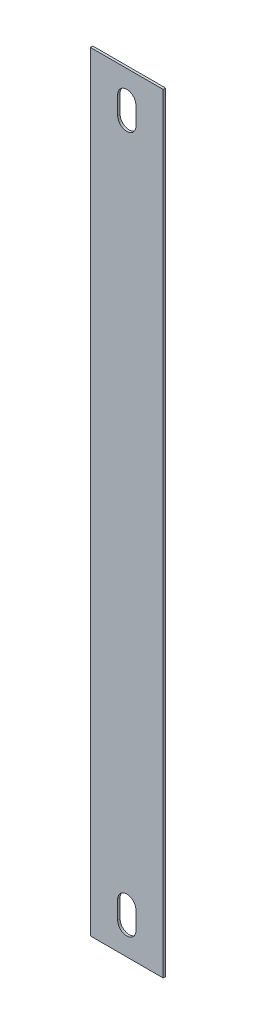
ISO-10303-21;
HEADER;
FILE_DESCRIPTION(('STEP AP214'),'2;1');
FILE_NAME('part.step','',(''),(''),'','','');
FILE_SCHEMA(('AUTOMOTIVE_DESIGN { 1 0 10303 214 1 1 1 1 }'));
ENDSEC;
DATA;
#1=APPLICATION_CONTEXT('core data for automotive mechanical design processes');
#2=APPLICATION_PROTOCOL_DEFINITION('international standard','automotive_design',2000,#1);
#3=PRODUCT_CONTEXT('',#1,'mechanical');
#4=PRODUCT('Part','Part','',(#3));
#5=PRODUCT_RELATED_PRODUCT_CATEGORY('part','',(#4));
#6=PRODUCT_DEFINITION_FORMATION('','',#4);
#7=PRODUCT_DEFINITION_CONTEXT('part definition',#1,'design');
#8=PRODUCT_DEFINITION('design','',#6,#7);
#9=PRODUCT_DEFINITION_SHAPE('','',#8);
#10=(LENGTH_UNIT() NAMED_UNIT(*) SI_UNIT(.MILLI.,.METRE.));
#11=(NAMED_UNIT(*) PLANE_ANGLE_UNIT() SI_UNIT($,.RADIAN.));
#12=(NAMED_UNIT(*) SI_UNIT($,.STERADIAN.) SOLID_ANGLE_UNIT());
#13=UNCERTAINTY_MEASURE_WITH_UNIT(LENGTH_MEASURE(1.E-05),#10,'distance_accuracy_value','');
#14=(GEOMETRIC_REPRESENTATION_CONTEXT(3) GLOBAL_UNCERTAINTY_ASSIGNED_CONTEXT((#13)) GLOBAL_UNIT_ASSIGNED_CONTEXT((#10,
#11,#12)) REPRESENTATION_CONTEXT('',''));
#15=CARTESIAN_POINT('',(0.,0.,0.));
#16=DIRECTION('',(0.,0.,1.));
#17=DIRECTION('',(1.,0.,0.));
#18=AXIS2_PLACEMENT_3D('',#15,#16,#17);
#19=CARTESIAN_POINT('',(-30.,-317.32,2.));
#20=DIRECTION('',(1.,0.,0.));
#21=DIRECTION('',(0.,0.,-1.));
#22=AXIS2_PLACEMENT_3D('',#19,#20,#21);
#23=PLANE('',#22);
#24=DIRECTION('',(0.,-1.,0.));
#25=VECTOR('',#24,1.);
#26=CARTESIAN_POINT('',(-30.,-317.32,0.));
#27=LINE('',#26,#25);
#28=CARTESIAN_POINT('',(-30.,317.32,0.));
#29=VERTEX_POINT('',#28);
#30=CARTESIAN_POINT('',(-30.,-317.32,0.));
#31=VERTEX_POINT('',#30);
#32=EDGE_CURVE('E143',#29,#31,#27,.T.);
#33=ORIENTED_EDGE('',*,*,#32,.T.);
#34=DIRECTION('',(0.,0.,-1.));
#35=VECTOR('',#34,1.);
#36=CARTESIAN_POINT('',(-30.,-317.32,2.));
#37=LINE('',#36,#35);
#38=CARTESIAN_POINT('',(-30.,-317.32,2.));
#39=VERTEX_POINT('',#38);
#40=EDGE_CURVE('E11',#39,#31,#37,.T.);
#41=ORIENTED_EDGE('',*,*,#40,.F.);
#42=DIRECTION('',(0.,-1.,0.));
#43=VECTOR('',#42,1.);
#44=CARTESIAN_POINT('',(-30.,-317.32,2.));
#45=LINE('',#44,#43);
#46=CARTESIAN_POINT('',(-30.,317.32,2.));
#47=VERTEX_POINT('',#46);
#48=EDGE_CURVE('E196',#47,#39,#45,.T.);
#49=ORIENTED_EDGE('',*,*,#48,.F.);
#50=DIRECTION('',(0.,0.,-1.));
#51=VECTOR('',#50,1.);
#52=CARTESIAN_POINT('',(-30.,317.32,2.));
#53=LINE('',#52,#51);
#54=EDGE_CURVE('E206',#47,#29,#53,.T.);
#55=ORIENTED_EDGE('',*,*,#54,.T.);
#56=EDGE_LOOP('',(#33,#41,#49,#55));
#57=FACE_BOUND('',#56,.T.);
#58=ADVANCED_FACE('F39',(#57),#23,.F.);
#59=CARTESIAN_POINT('',(30.,-317.32,2.));
#60=DIRECTION('',(0.,1.,0.));
#61=DIRECTION('',(0.,0.,1.));
#62=AXIS2_PLACEMENT_3D('',#59,#60,#61);
#63=PLANE('',#62);
#64=DIRECTION('',(1.,0.,0.));
#65=VECTOR('',#64,1.);
#66=CARTESIAN_POINT('',(30.,-317.32,0.));
#67=LINE('',#66,#65);
#68=CARTESIAN_POINT('',(30.,-317.32,0.));
#69=VERTEX_POINT('',#68);
#70=EDGE_CURVE('E209',#31,#69,#67,.T.);
#71=ORIENTED_EDGE('',*,*,#70,.T.);
#72=DIRECTION('',(0.,0.,-1.));
#73=VECTOR('',#72,1.);
#74=CARTESIAN_POINT('',(30.,-317.32,2.));
#75=LINE('',#74,#73);
#76=CARTESIAN_POINT('',(30.,-317.32,2.));
#77=VERTEX_POINT('',#76);
#78=EDGE_CURVE('E46',#77,#69,#75,.T.);
#79=ORIENTED_EDGE('',*,*,#78,.F.);
#80=DIRECTION('',(1.,0.,0.));
#81=VECTOR('',#80,1.);
#82=CARTESIAN_POINT('',(30.,-317.32,2.));
#83=LINE('',#82,#81);
#84=EDGE_CURVE('E199',#39,#77,#83,.T.);
#85=ORIENTED_EDGE('',*,*,#84,.F.);
#86=ORIENTED_EDGE('',*,*,#40,.T.);
#87=EDGE_LOOP('',(#71,#79,#85,#86));
#88=FACE_BOUND('',#87,.T.);
#89=ADVANCED_FACE('F238',(#88),#63,.F.);
#90=CARTESIAN_POINT('',(30.,-317.32,2.));
#91=DIRECTION('',(-1.,0.,0.));
#92=DIRECTION('',(0.,0.,1.));
#93=AXIS2_PLACEMENT_3D('',#90,#91,#92);
#94=PLANE('',#93);
#95=DIRECTION('',(0.,1.,0.));
#96=VECTOR('',#95,1.);
#97=CARTESIAN_POINT('',(30.,-317.32,0.));
#98=LINE('',#97,#96);
#99=CARTESIAN_POINT('',(30.,317.32,0.));
#100=VERTEX_POINT('',#99);
#101=EDGE_CURVE('E211',#69,#100,#98,.T.);
#102=ORIENTED_EDGE('',*,*,#101,.T.);
#103=DIRECTION('',(0.,0.,-1.));
#104=VECTOR('',#103,1.);
#105=CARTESIAN_POINT('',(30.,317.32,2.));
#106=LINE('',#105,#104);
#107=CARTESIAN_POINT('',(30.,317.32,2.));
#108=VERTEX_POINT('',#107);
#109=EDGE_CURVE('E216',#108,#100,#106,.T.);
#110=ORIENTED_EDGE('',*,*,#109,.F.);
#111=DIRECTION('',(0.,1.,0.));
#112=VECTOR('',#111,1.);
#113=CARTESIAN_POINT('',(30.,-317.32,2.));
#114=LINE('',#113,#112);
#115=EDGE_CURVE('E202',#77,#108,#114,.T.);
#116=ORIENTED_EDGE('',*,*,#115,.F.);
#117=ORIENTED_EDGE('',*,*,#78,.T.);
#118=EDGE_LOOP('',(#102,#110,#116,#117));
#119=FACE_BOUND('',#118,.T.);
#120=ADVANCED_FACE('F223',(#119),#94,.F.);
#121=CARTESIAN_POINT('',(30.,317.32,2.));
#122=DIRECTION('',(0.,-1.,0.));
#123=DIRECTION('',(0.,0.,-1.));
#124=AXIS2_PLACEMENT_3D('',#121,#122,#123);
#125=PLANE('',#124);
#126=DIRECTION('',(-1.,0.,0.));
#127=VECTOR('',#126,1.);
#128=CARTESIAN_POINT('',(30.,317.32,0.));
#129=LINE('',#128,#127);
#130=EDGE_CURVE('E200',#100,#29,#129,.T.);
#131=ORIENTED_EDGE('',*,*,#130,.T.);
#132=ORIENTED_EDGE('',*,*,#54,.F.);
#133=DIRECTION('',(-1.,0.,0.));
#134=VECTOR('',#133,1.);
#135=CARTESIAN_POINT('',(30.,317.32,2.));
#136=LINE('',#135,#134);
#137=EDGE_CURVE('E204',#108,#47,#136,.T.);
#138=ORIENTED_EDGE('',*,*,#137,.F.);
#139=ORIENTED_EDGE('',*,*,#109,.T.);
#140=EDGE_LOOP('',(#131,#132,#138,#139));
#141=FACE_BOUND('',#140,.T.);
#142=ADVANCED_FACE('F231',(#141),#125,.F.);
#143=CARTESIAN_POINT('',(0.,0.,2.));
#144=DIRECTION('',(0.,0.,1.));
#145=DIRECTION('',(1.,0.,0.));
#146=AXIS2_PLACEMENT_3D('',#143,#144,#145);
#147=PLANE('',#146);
#148=CARTESIAN_POINT('',(0.,294.82,2.));
#149=DIRECTION('',(0.,0.,1.));
#150=DIRECTION('',(1.,0.,0.));
#151=AXIS2_PLACEMENT_3D('',#148,#149,#150);
#152=CIRCLE('',#151,7.5);
#153=CARTESIAN_POINT('',(7.5,294.82,2.));
#154=VERTEX_POINT('',#153);
#155=CARTESIAN_POINT('',(-7.5,294.82,2.));
#156=VERTEX_POINT('',#155);
#157=EDGE_CURVE('E53',#154,#156,#152,.T.);
#158=ORIENTED_EDGE('',*,*,#157,.F.);
#159=DIRECTION('',(0.,1.,0.));
#160=VECTOR('',#159,1.);
#161=CARTESIAN_POINT('',(7.5,294.82,2.));
#162=LINE('',#161,#160);
#163=CARTESIAN_POINT('',(7.5,279.82,2.));
#164=VERTEX_POINT('',#163);
#165=EDGE_CURVE('E135',#164,#154,#162,.T.);
#166=ORIENTED_EDGE('',*,*,#165,.F.);
#167=CARTESIAN_POINT('',(0.,279.82,2.));
#168=DIRECTION('',(0.,0.,1.));
#169=DIRECTION('',(1.,0.,0.));
#170=AXIS2_PLACEMENT_3D('',#167,#168,#169);
#171=CIRCLE('',#170,7.5);
#172=CARTESIAN_POINT('',(-7.5,279.82,2.));
#173=VERTEX_POINT('',#172);
#174=EDGE_CURVE('E158',#173,#164,#171,.T.);
#175=ORIENTED_EDGE('',*,*,#174,.F.);
#176=DIRECTION('',(0.,-1.,0.));
#177=VECTOR('',#176,1.);
#178=CARTESIAN_POINT('',(-7.5,294.82,2.));
#179=LINE('',#178,#177);
#180=EDGE_CURVE('E151',#156,#173,#179,.T.);
#181=ORIENTED_EDGE('',*,*,#180,.F.);
#182=EDGE_LOOP('',(#158,#166,#175,#181));
#183=FACE_BOUND('',#182,.T.);
#184=CARTESIAN_POINT('',(0.,-294.82,2.));
#185=DIRECTION('',(0.,0.,1.));
#186=DIRECTION('',(-1.,0.,0.));
#187=AXIS2_PLACEMENT_3D('',#184,#185,#186);
#188=CIRCLE('',#187,7.5);
#189=CARTESIAN_POINT('',(-7.5,-294.82,2.));
#190=VERTEX_POINT('',#189);
#191=CARTESIAN_POINT('',(7.5,-294.82,2.));
#192=VERTEX_POINT('',#191);
#193=EDGE_CURVE('E61',#190,#192,#188,.T.);
#194=ORIENTED_EDGE('',*,*,#193,.F.);
#195=DIRECTION('',(0.,-1.,0.));
#196=VECTOR('',#195,1.);
#197=CARTESIAN_POINT('',(-7.5,-294.82,2.));
#198=LINE('',#197,#196);
#199=CARTESIAN_POINT('',(-7.5,-279.82,2.));
#200=VERTEX_POINT('',#199);
#201=EDGE_CURVE('E173',#200,#190,#198,.T.);
#202=ORIENTED_EDGE('',*,*,#201,.F.);
#203=CARTESIAN_POINT('',(0.,-279.82,2.));
#204=DIRECTION('',(0.,0.,1.));
#205=DIRECTION('',(-1.,0.,0.));
#206=AXIS2_PLACEMENT_3D('',#203,#204,#205);
#207=CIRCLE('',#206,7.5);
#208=CARTESIAN_POINT('',(7.5,-279.82,2.));
#209=VERTEX_POINT('',#208);
#210=EDGE_CURVE('E181',#209,#200,#207,.T.);
#211=ORIENTED_EDGE('',*,*,#210,.F.);
#212=DIRECTION('',(0.,1.,0.));
#213=VECTOR('',#212,1.);
#214=CARTESIAN_POINT('',(7.5,-294.82,2.));
#215=LINE('',#214,#213);
#216=EDGE_CURVE('E184',#192,#209,#215,.T.);
#217=ORIENTED_EDGE('',*,*,#216,.F.);
#218=EDGE_LOOP('',(#194,#202,#211,#217));
#219=FACE_BOUND('',#218,.T.);
#220=ORIENTED_EDGE('',*,*,#48,.T.);
#221=ORIENTED_EDGE('',*,*,#84,.T.);
#222=ORIENTED_EDGE('',*,*,#115,.T.);
#223=ORIENTED_EDGE('',*,*,#137,.T.);
#224=EDGE_LOOP('',(#220,#221,#222,#223));
#225=FACE_BOUND('',#224,.T.);
#226=ADVANCED_FACE('F237',(#183,#219,#225),#147,.T.);
#227=CARTESIAN_POINT('',(0.,0.,0.));
#228=DIRECTION('',(0.,0.,1.));
#229=DIRECTION('',(1.,0.,0.));
#230=AXIS2_PLACEMENT_3D('',#227,#228,#229);
#231=PLANE('',#230);
#232=DIRECTION('',(0.,-1.,0.));
#233=VECTOR('',#232,1.);
#234=CARTESIAN_POINT('',(7.5,294.82,0.));
#235=LINE('',#234,#233);
#236=CARTESIAN_POINT('',(7.5,294.82,0.));
#237=VERTEX_POINT('',#236);
#238=CARTESIAN_POINT('',(7.5,279.82,0.));
#239=VERTEX_POINT('',#238);
#240=EDGE_CURVE('E149',#237,#239,#235,.T.);
#241=ORIENTED_EDGE('',*,*,#240,.F.);
#242=CARTESIAN_POINT('',(0.,294.82,0.));
#243=DIRECTION('',(0.,0.,1.));
#244=DIRECTION('',(1.,0.,0.));
#245=AXIS2_PLACEMENT_3D('',#242,#243,#244);
#246=CIRCLE('',#245,7.5);
#247=CARTESIAN_POINT('',(-7.5,294.82,0.));
#248=VERTEX_POINT('',#247);
#249=EDGE_CURVE('E129',#248,#237,#246,.F.);
#250=ORIENTED_EDGE('',*,*,#249,.F.);
#251=DIRECTION('',(0.,1.,0.));
#252=VECTOR('',#251,1.);
#253=CARTESIAN_POINT('',(-7.5,294.82,0.));
#254=LINE('',#253,#252);
#255=CARTESIAN_POINT('',(-7.5,279.82,0.));
#256=VERTEX_POINT('',#255);
#257=EDGE_CURVE('E139',#256,#248,#254,.T.);
#258=ORIENTED_EDGE('',*,*,#257,.F.);
#259=CARTESIAN_POINT('',(0.,279.82,0.));
#260=DIRECTION('',(0.,0.,1.));
#261=DIRECTION('',(1.,0.,0.));
#262=AXIS2_PLACEMENT_3D('',#259,#260,#261);
#263=CIRCLE('',#262,7.5);
#264=EDGE_CURVE('E153',#239,#256,#263,.F.);
#265=ORIENTED_EDGE('',*,*,#264,.F.);
#266=EDGE_LOOP('',(#241,#250,#258,#265));
#267=FACE_BOUND('',#266,.T.);
#268=DIRECTION('',(0.,1.,0.));
#269=VECTOR('',#268,1.);
#270=CARTESIAN_POINT('',(-7.5,-294.82,0.));
#271=LINE('',#270,#269);
#272=CARTESIAN_POINT('',(-7.5,-294.82,0.));
#273=VERTEX_POINT('',#272);
#274=CARTESIAN_POINT('',(-7.5,-279.82,0.));
#275=VERTEX_POINT('',#274);
#276=EDGE_CURVE('E191',#273,#275,#271,.T.);
#277=ORIENTED_EDGE('',*,*,#276,.F.);
#278=CARTESIAN_POINT('',(0.,-294.82,0.));
#279=DIRECTION('',(0.,0.,1.));
#280=DIRECTION('',(1.,0.,0.));
#281=AXIS2_PLACEMENT_3D('',#278,#279,#280);
#282=CIRCLE('',#281,7.5);
#283=CARTESIAN_POINT('',(7.5,-294.82,0.));
#284=VERTEX_POINT('',#283);
#285=EDGE_CURVE('E188',#284,#273,#282,.F.);
#286=ORIENTED_EDGE('',*,*,#285,.F.);
#287=DIRECTION('',(0.,-1.,0.));
#288=VECTOR('',#287,1.);
#289=CARTESIAN_POINT('',(7.5,-294.82,0.));
#290=LINE('',#289,#288);
#291=CARTESIAN_POINT('',(7.5,-279.82,0.));
#292=VERTEX_POINT('',#291);
#293=EDGE_CURVE('E167',#292,#284,#290,.T.);
#294=ORIENTED_EDGE('',*,*,#293,.F.);
#295=CARTESIAN_POINT('',(0.,-279.82,0.));
#296=DIRECTION('',(0.,0.,1.));
#297=DIRECTION('',(1.,0.,0.));
#298=AXIS2_PLACEMENT_3D('',#295,#296,#297);
#299=CIRCLE('',#298,7.5);
#300=EDGE_CURVE('E194',#275,#292,#299,.F.);
#301=ORIENTED_EDGE('',*,*,#300,.F.);
#302=EDGE_LOOP('',(#277,#286,#294,#301));
#303=FACE_BOUND('',#302,.T.);
#304=ORIENTED_EDGE('',*,*,#32,.F.);
#305=ORIENTED_EDGE('',*,*,#130,.F.);
#306=ORIENTED_EDGE('',*,*,#101,.F.);
#307=ORIENTED_EDGE('',*,*,#70,.F.);
#308=EDGE_LOOP('',(#304,#305,#306,#307));
#309=FACE_BOUND('',#308,.T.);
#310=ADVANCED_FACE('F146',(#267,#303,#309),#231,.F.);
#311=CARTESIAN_POINT('',(0.,-294.82,-0.00100000000000013));
#312=DIRECTION('',(0.,0.,1.));
#313=DIRECTION('',(1.,0.,0.));
#314=AXIS2_PLACEMENT_3D('',#311,#312,#313);
#315=CYLINDRICAL_SURFACE('',#314,7.5);
#316=ORIENTED_EDGE('',*,*,#285,.T.);
#317=DIRECTION('',(0.,0.,1.));
#318=VECTOR('',#317,1.);
#319=CARTESIAN_POINT('',(-7.5,-294.82,-0.00100000000000013));
#320=LINE('',#319,#318);
#321=EDGE_CURVE('E170',#273,#190,#320,.T.);
#322=ORIENTED_EDGE('',*,*,#321,.T.);
#323=ORIENTED_EDGE('',*,*,#193,.T.);
#324=DIRECTION('',(0.,0.,1.));
#325=VECTOR('',#324,1.);
#326=CARTESIAN_POINT('',(7.5,-294.82,-0.00100000000000013));
#327=LINE('',#326,#325);
#328=EDGE_CURVE('E171',#284,#192,#327,.T.);
#329=ORIENTED_EDGE('',*,*,#328,.F.);
#330=EDGE_LOOP('',(#316,#322,#323,#329));
#331=FACE_BOUND('',#330,.T.);
#332=ADVANCED_FACE('F250',(#331),#315,.F.);
#333=CARTESIAN_POINT('',(-7.5,-294.82,-0.00100000000000013));
#334=DIRECTION('',(-1.,0.,0.));
#335=DIRECTION('',(0.,-1.,0.));
#336=AXIS2_PLACEMENT_3D('',#333,#334,#335);
#337=PLANE('',#336);
#338=ORIENTED_EDGE('',*,*,#276,.T.);
#339=DIRECTION('',(0.,0.,1.));
#340=VECTOR('',#339,1.);
#341=CARTESIAN_POINT('',(-7.5,-279.82,-0.00100000000000013));
#342=LINE('',#341,#340);
#343=EDGE_CURVE('E176',#275,#200,#342,.T.);
#344=ORIENTED_EDGE('',*,*,#343,.T.);
#345=ORIENTED_EDGE('',*,*,#201,.T.);
#346=ORIENTED_EDGE('',*,*,#321,.F.);
#347=EDGE_LOOP('',(#338,#344,#345,#346));
#348=FACE_BOUND('',#347,.T.);
#349=ADVANCED_FACE('F254',(#348),#337,.F.);
#350=CARTESIAN_POINT('',(0.,-279.82,-0.00100000000000013));
#351=DIRECTION('',(0.,0.,1.));
#352=DIRECTION('',(1.,0.,0.));
#353=AXIS2_PLACEMENT_3D('',#350,#351,#352);
#354=CYLINDRICAL_SURFACE('',#353,7.5);
#355=ORIENTED_EDGE('',*,*,#300,.T.);
#356=DIRECTION('',(0.,0.,1.));
#357=VECTOR('',#356,1.);
#358=CARTESIAN_POINT('',(7.5,-279.82,-0.00100000000000013));
#359=LINE('',#358,#357);
#360=EDGE_CURVE('E174',#292,#209,#359,.T.);
#361=ORIENTED_EDGE('',*,*,#360,.T.);
#362=ORIENTED_EDGE('',*,*,#210,.T.);
#363=ORIENTED_EDGE('',*,*,#343,.F.);
#364=EDGE_LOOP('',(#355,#361,#362,#363));
#365=FACE_BOUND('',#364,.T.);
#366=ADVANCED_FACE('F257',(#365),#354,.F.);
#367=CARTESIAN_POINT('',(7.5,-294.82,-0.00100000000000013));
#368=DIRECTION('',(1.,0.,0.));
#369=DIRECTION('',(0.,1.,0.));
#370=AXIS2_PLACEMENT_3D('',#367,#368,#369);
#371=PLANE('',#370);
#372=ORIENTED_EDGE('',*,*,#293,.T.);
#373=ORIENTED_EDGE('',*,*,#328,.T.);
#374=ORIENTED_EDGE('',*,*,#216,.T.);
#375=ORIENTED_EDGE('',*,*,#360,.F.);
#376=EDGE_LOOP('',(#372,#373,#374,#375));
#377=FACE_BOUND('',#376,.T.);
#378=ADVANCED_FACE('F261',(#377),#371,.F.);
#379=CARTESIAN_POINT('',(0.,294.82,-0.00100000000000013));
#380=DIRECTION('',(0.,0.,1.));
#381=DIRECTION('',(1.,0.,0.));
#382=AXIS2_PLACEMENT_3D('',#379,#380,#381);
#383=CYLINDRICAL_SURFACE('',#382,7.5);
#384=ORIENTED_EDGE('',*,*,#249,.T.);
#385=DIRECTION('',(0.,0.,1.));
#386=VECTOR('',#385,1.);
#387=CARTESIAN_POINT('',(7.5,294.82,-0.00100000000000013));
#388=LINE('',#387,#386);
#389=EDGE_CURVE('E144',#237,#154,#388,.T.);
#390=ORIENTED_EDGE('',*,*,#389,.T.);
#391=ORIENTED_EDGE('',*,*,#157,.T.);
#392=DIRECTION('',(0.,0.,1.));
#393=VECTOR('',#392,1.);
#394=CARTESIAN_POINT('',(-7.5,294.82,-0.00100000000000013));
#395=LINE('',#394,#393);
#396=EDGE_CURVE('E125',#248,#156,#395,.T.);
#397=ORIENTED_EDGE('',*,*,#396,.F.);
#398=EDGE_LOOP('',(#384,#390,#391,#397));
#399=FACE_BOUND('',#398,.T.);
#400=ADVANCED_FACE('F127',(#399),#383,.F.);
#401=CARTESIAN_POINT('',(7.5,294.82,-0.00100000000000013));
#402=DIRECTION('',(1.,0.,0.));
#403=DIRECTION('',(0.,1.,0.));
#404=AXIS2_PLACEMENT_3D('',#401,#402,#403);
#405=PLANE('',#404);
#406=ORIENTED_EDGE('',*,*,#240,.T.);
#407=DIRECTION('',(0.,0.,1.));
#408=VECTOR('',#407,1.);
#409=CARTESIAN_POINT('',(7.5,279.82,-0.00100000000000013));
#410=LINE('',#409,#408);
#411=EDGE_CURVE('E164',#239,#164,#410,.T.);
#412=ORIENTED_EDGE('',*,*,#411,.T.);
#413=ORIENTED_EDGE('',*,*,#165,.T.);
#414=ORIENTED_EDGE('',*,*,#389,.F.);
#415=EDGE_LOOP('',(#406,#412,#413,#414));
#416=FACE_BOUND('',#415,.T.);
#417=ADVANCED_FACE('F270',(#416),#405,.F.);
#418=CARTESIAN_POINT('',(0.,279.82,-0.00100000000000013));
#419=DIRECTION('',(0.,0.,1.));
#420=DIRECTION('',(1.,0.,0.));
#421=AXIS2_PLACEMENT_3D('',#418,#419,#420);
#422=CYLINDRICAL_SURFACE('',#421,7.5);
#423=ORIENTED_EDGE('',*,*,#264,.T.);
#424=DIRECTION('',(0.,0.,1.));
#425=VECTOR('',#424,1.);
#426=CARTESIAN_POINT('',(-7.5,279.82,-0.00100000000000013));
#427=LINE('',#426,#425);
#428=EDGE_CURVE('E134',#256,#173,#427,.T.);
#429=ORIENTED_EDGE('',*,*,#428,.T.);
#430=ORIENTED_EDGE('',*,*,#174,.T.);
#431=ORIENTED_EDGE('',*,*,#411,.F.);
#432=EDGE_LOOP('',(#423,#429,#430,#431));
#433=FACE_BOUND('',#432,.T.);
#434=ADVANCED_FACE('F273',(#433),#422,.F.);
#435=CARTESIAN_POINT('',(-7.5,294.82,-0.00100000000000013));
#436=DIRECTION('',(-1.,0.,0.));
#437=DIRECTION('',(0.,0.,1.));
#438=AXIS2_PLACEMENT_3D('',#435,#436,#437);
#439=PLANE('',#438);
#440=ORIENTED_EDGE('',*,*,#257,.T.);
#441=ORIENTED_EDGE('',*,*,#396,.T.);
#442=ORIENTED_EDGE('',*,*,#180,.T.);
#443=ORIENTED_EDGE('',*,*,#428,.F.);
#444=EDGE_LOOP('',(#440,#441,#442,#443));
#445=FACE_BOUND('',#444,.T.);
#446=ADVANCED_FACE('F140',(#445),#439,.F.);
#447=CLOSED_SHELL('',(#58,#89,#120,#142,#226,#310,#332,#349,#366,#378,#400,#417,#434,#446));
#448=MANIFOLD_SOLID_BREP('B2',#447);
#449=ADVANCED_BREP_SHAPE_REPRESENTATION('',(#18,#448),#14);
#450=SHAPE_DEFINITION_REPRESENTATION(#9,#449);
ENDSEC;
END-ISO-10303-21;
